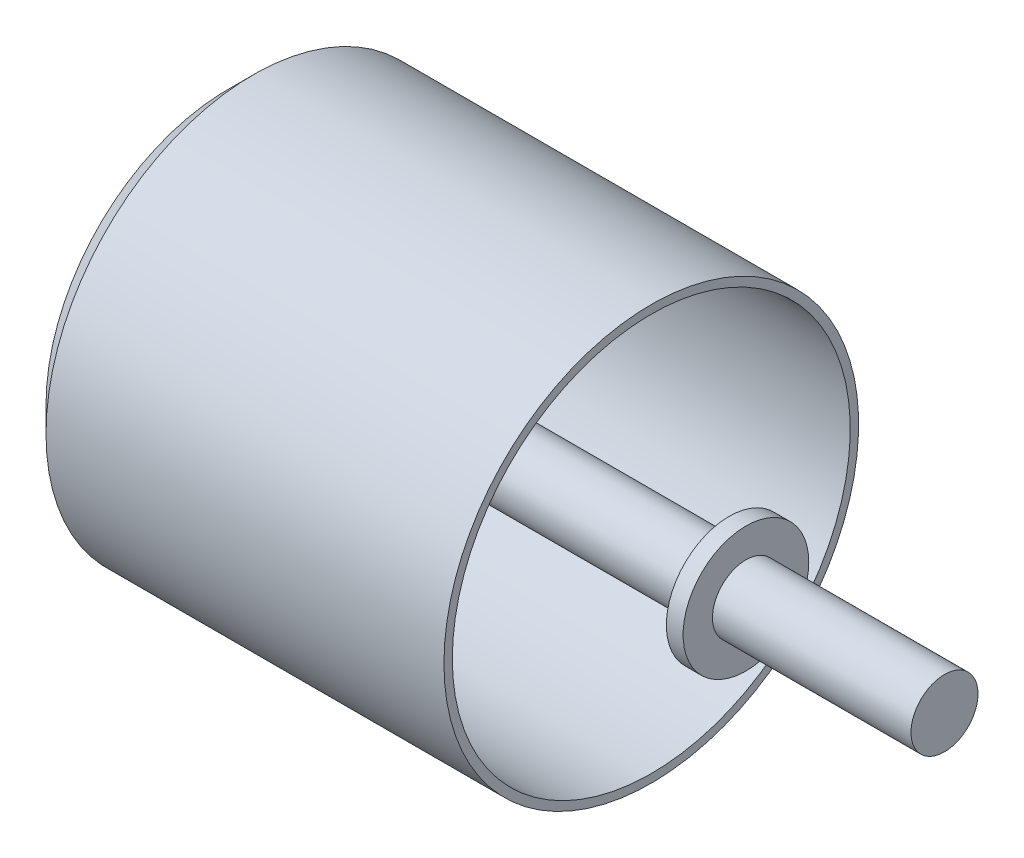
ISO-10303-21;
HEADER;
FILE_DESCRIPTION(('STEP AP214'),'2;1');
FILE_NAME('part.step','',(''),(''),'','','');
FILE_SCHEMA(('AUTOMOTIVE_DESIGN { 1 0 10303 214 1 1 1 1 }'));
ENDSEC;
DATA;
#1=APPLICATION_CONTEXT('core data for automotive mechanical design processes');
#2=APPLICATION_PROTOCOL_DEFINITION('international standard','automotive_design',2000,#1);
#3=PRODUCT_CONTEXT('',#1,'mechanical');
#4=PRODUCT('Part','Part','',(#3));
#5=PRODUCT_RELATED_PRODUCT_CATEGORY('part','',(#4));
#6=PRODUCT_DEFINITION_FORMATION('','',#4);
#7=PRODUCT_DEFINITION_CONTEXT('part definition',#1,'design');
#8=PRODUCT_DEFINITION('design','',#6,#7);
#9=PRODUCT_DEFINITION_SHAPE('','',#8);
#10=(LENGTH_UNIT() NAMED_UNIT(*) SI_UNIT(.MILLI.,.METRE.));
#11=(NAMED_UNIT(*) PLANE_ANGLE_UNIT() SI_UNIT($,.RADIAN.));
#12=(NAMED_UNIT(*) SI_UNIT($,.STERADIAN.) SOLID_ANGLE_UNIT());
#13=UNCERTAINTY_MEASURE_WITH_UNIT(LENGTH_MEASURE(1.E-05),#10,'distance_accuracy_value','');
#14=(GEOMETRIC_REPRESENTATION_CONTEXT(3) GLOBAL_UNCERTAINTY_ASSIGNED_CONTEXT((#13)) GLOBAL_UNIT_ASSIGNED_CONTEXT((#10,
#11,#12)) REPRESENTATION_CONTEXT('',''));
#15=CARTESIAN_POINT('',(0.,0.,0.));
#16=DIRECTION('',(0.,0.,1.));
#17=DIRECTION('',(1.,0.,0.));
#18=AXIS2_PLACEMENT_3D('',#15,#16,#17);
#19=CARTESIAN_POINT('',(85.5,0.,0.));
#20=DIRECTION('',(-1.,0.,0.));
#21=DIRECTION('',(0.,0.,1.));
#22=AXIS2_PLACEMENT_3D('',#19,#20,#21);
#23=CYLINDRICAL_SURFACE('',#22,4.);
#24=CARTESIAN_POINT('',(1.,0.,0.));
#25=DIRECTION('',(-1.,0.,0.));
#26=DIRECTION('',(0.,0.,1.));
#27=AXIS2_PLACEMENT_3D('',#24,#25,#26);
#28=CIRCLE('',#27,4.);
#29=CARTESIAN_POINT('',(1.,0.,4.));
#30=VERTEX_POINT('',#29);
#31=EDGE_CURVE('E43',#30,#30,#28,.F.);
#32=ORIENTED_EDGE('',*,*,#31,.T.);
#33=EDGE_LOOP('',(#32));
#34=FACE_BOUND('',#33,.T.);
#35=CARTESIAN_POINT('',(59.8,0.,0.));
#36=DIRECTION('',(1.,0.,0.));
#37=DIRECTION('',(0.,0.,-1.));
#38=AXIS2_PLACEMENT_3D('',#35,#36,#37);
#39=CIRCLE('',#38,4.);
#40=CARTESIAN_POINT('',(59.8,0.,-4.));
#41=VERTEX_POINT('',#40);
#42=EDGE_CURVE('E10',#41,#41,#39,.T.);
#43=ORIENTED_EDGE('',*,*,#42,.F.);
#44=EDGE_LOOP('',(#43));
#45=FACE_BOUND('',#44,.T.);
#46=ADVANCED_FACE('F35',(#34,#45),#23,.T.);
#47=CARTESIAN_POINT('',(1.,0.,0.));
#48=DIRECTION('',(-1.,0.,0.));
#49=DIRECTION('',(0.,0.,1.));
#50=AXIS2_PLACEMENT_3D('',#47,#48,#49);
#51=PLANE('',#50);
#52=CARTESIAN_POINT('',(1.,17.,0.));
#53=DIRECTION('',(-1.,0.,0.));
#54=DIRECTION('',(0.,0.,1.));
#55=AXIS2_PLACEMENT_3D('',#52,#53,#54);
#56=CIRCLE('',#55,3.5);
#57=CARTESIAN_POINT('',(1.,17.,3.5));
#58=VERTEX_POINT('',#57);
#59=EDGE_CURVE('E70',#58,#58,#56,.T.);
#60=ORIENTED_EDGE('',*,*,#59,.T.);
#61=EDGE_LOOP('',(#60));
#62=FACE_BOUND('',#61,.T.);
#63=CARTESIAN_POINT('',(1.,0.,17.));
#64=DIRECTION('',(-1.,0.,0.));
#65=DIRECTION('',(0.,0.,1.));
#66=AXIS2_PLACEMENT_3D('',#63,#64,#65);
#67=CIRCLE('',#66,3.5);
#68=CARTESIAN_POINT('',(1.,0.,20.5));
#69=VERTEX_POINT('',#68);
#70=EDGE_CURVE('E73',#69,#69,#67,.T.);
#71=ORIENTED_EDGE('',*,*,#70,.T.);
#72=EDGE_LOOP('',(#71));
#73=FACE_BOUND('',#72,.T.);
#74=CARTESIAN_POINT('',(1.,-17.,0.));
#75=DIRECTION('',(-1.,0.,0.));
#76=DIRECTION('',(0.,0.,1.));
#77=AXIS2_PLACEMENT_3D('',#74,#75,#76);
#78=CIRCLE('',#77,3.5);
#79=CARTESIAN_POINT('',(1.,-17.,3.5));
#80=VERTEX_POINT('',#79);
#81=EDGE_CURVE('E76',#80,#80,#78,.T.);
#82=ORIENTED_EDGE('',*,*,#81,.T.);
#83=EDGE_LOOP('',(#82));
#84=FACE_BOUND('',#83,.T.);
#85=CARTESIAN_POINT('',(1.,0.,-17.));
#86=DIRECTION('',(-1.,0.,0.));
#87=DIRECTION('',(0.,0.,1.));
#88=AXIS2_PLACEMENT_3D('',#85,#86,#87);
#89=CIRCLE('',#88,3.5);
#90=CARTESIAN_POINT('',(1.,0.,-13.5));
#91=VERTEX_POINT('',#90);
#92=EDGE_CURVE('E79',#91,#91,#89,.T.);
#93=ORIENTED_EDGE('',*,*,#92,.T.);
#94=EDGE_LOOP('',(#93));
#95=FACE_BOUND('',#94,.T.);
#96=ORIENTED_EDGE('',*,*,#31,.F.);
#97=EDGE_LOOP('',(#96));
#98=FACE_BOUND('',#97,.T.);
#99=CARTESIAN_POINT('',(1.,0.,0.));
#100=DIRECTION('',(-1.,0.,0.));
#101=DIRECTION('',(0.,0.,1.));
#102=AXIS2_PLACEMENT_3D('',#99,#100,#101);
#103=CIRCLE('',#102,21.3357864376269);
#104=CARTESIAN_POINT('',(1.,0.,21.3357864376269));
#105=VERTEX_POINT('',#104);
#106=EDGE_CURVE('E47',#105,#105,#103,.T.);
#107=ORIENTED_EDGE('',*,*,#106,.F.);
#108=EDGE_LOOP('',(#107));
#109=FACE_BOUND('',#108,.T.);
#110=ADVANCED_FACE('F37',(#62,#73,#84,#95,#98,#109),#51,.F.);
#111=CARTESIAN_POINT('',(1.,0.,0.));
#112=DIRECTION('',(1.,0.,0.));
#113=DIRECTION('',(0.,0.,-1.));
#114=AXIS2_PLACEMENT_3D('',#111,#112,#113);
#115=CONICAL_SURFACE('',#114,21.3357864376269,0.785398163397449);
#116=CARTESIAN_POINT('',(3.41421356237309,0.,0.));
#117=DIRECTION('',(-1.,0.,0.));
#118=DIRECTION('',(0.,0.,1.));
#119=AXIS2_PLACEMENT_3D('',#116,#117,#118);
#120=CIRCLE('',#119,23.75);
#121=CARTESIAN_POINT('',(3.41421356237309,0.,23.75));
#122=VERTEX_POINT('',#121);
#123=EDGE_CURVE('E52',#122,#122,#120,.T.);
#124=ORIENTED_EDGE('',*,*,#123,.F.);
#125=EDGE_LOOP('',(#124));
#126=FACE_BOUND('',#125,.T.);
#127=ORIENTED_EDGE('',*,*,#106,.T.);
#128=EDGE_LOOP('',(#127));
#129=FACE_BOUND('',#128,.T.);
#130=ADVANCED_FACE('F127',(#126,#129),#115,.F.);
#131=CARTESIAN_POINT('',(0.,0.,0.));
#132=DIRECTION('',(-1.,0.,0.));
#133=DIRECTION('',(0.,0.,1.));
#134=AXIS2_PLACEMENT_3D('',#131,#132,#133);
#135=CYLINDRICAL_SURFACE('',#134,23.75);
#136=CARTESIAN_POINT('',(50.5,0.,0.));
#137=DIRECTION('',(-1.,0.,0.));
#138=DIRECTION('',(0.,0.,1.));
#139=AXIS2_PLACEMENT_3D('',#136,#137,#138);
#140=CIRCLE('',#139,23.75);
#141=CARTESIAN_POINT('',(50.5,0.,23.75));
#142=VERTEX_POINT('',#141);
#143=EDGE_CURVE('E55',#142,#142,#140,.T.);
#144=ORIENTED_EDGE('',*,*,#143,.F.);
#145=EDGE_LOOP('',(#144));
#146=FACE_BOUND('',#145,.T.);
#147=ORIENTED_EDGE('',*,*,#123,.T.);
#148=EDGE_LOOP('',(#147));
#149=FACE_BOUND('',#148,.T.);
#150=ADVANCED_FACE('F172',(#146,#149),#135,.F.);
#151=CARTESIAN_POINT('',(50.5,23.75,0.));
#152=DIRECTION('',(-1.,0.,0.));
#153=DIRECTION('',(0.,0.,1.));
#154=AXIS2_PLACEMENT_3D('',#151,#152,#153);
#155=PLANE('',#154);
#156=CARTESIAN_POINT('',(50.5,0.,0.));
#157=DIRECTION('',(-1.,0.,0.));
#158=DIRECTION('',(0.,0.,1.));
#159=AXIS2_PLACEMENT_3D('',#156,#157,#158);
#160=CIRCLE('',#159,24.75);
#161=CARTESIAN_POINT('',(50.5,0.,24.75));
#162=VERTEX_POINT('',#161);
#163=EDGE_CURVE('E58',#162,#162,#160,.T.);
#164=ORIENTED_EDGE('',*,*,#163,.F.);
#165=EDGE_LOOP('',(#164));
#166=FACE_BOUND('',#165,.T.);
#167=ORIENTED_EDGE('',*,*,#143,.T.);
#168=EDGE_LOOP('',(#167));
#169=FACE_BOUND('',#168,.T.);
#170=ADVANCED_FACE('F177',(#166,#169),#155,.F.);
#171=CARTESIAN_POINT('',(0.,0.,0.));
#172=DIRECTION('',(-1.,0.,0.));
#173=DIRECTION('',(0.,0.,1.));
#174=AXIS2_PLACEMENT_3D('',#171,#172,#173);
#175=CYLINDRICAL_SURFACE('',#174,24.75);
#176=CARTESIAN_POINT('',(3.,0.,0.));
#177=DIRECTION('',(-1.,0.,0.));
#178=DIRECTION('',(0.,0.,1.));
#179=AXIS2_PLACEMENT_3D('',#176,#177,#178);
#180=CIRCLE('',#179,24.75);
#181=CARTESIAN_POINT('',(3.,0.,24.75));
#182=VERTEX_POINT('',#181);
#183=EDGE_CURVE('E61',#182,#182,#180,.T.);
#184=ORIENTED_EDGE('',*,*,#183,.F.);
#185=EDGE_LOOP('',(#184));
#186=FACE_BOUND('',#185,.T.);
#187=ORIENTED_EDGE('',*,*,#163,.T.);
#188=EDGE_LOOP('',(#187));
#189=FACE_BOUND('',#188,.T.);
#190=ADVANCED_FACE('F184',(#186,#189),#175,.T.);
#191=CARTESIAN_POINT('',(3.,0.,0.));
#192=DIRECTION('',(1.,0.,0.));
#193=DIRECTION('',(0.,0.,-1.));
#194=AXIS2_PLACEMENT_3D('',#191,#192,#193);
#195=CONICAL_SURFACE('',#194,24.75,0.78539816339745);
#196=CARTESIAN_POINT('',(0.,0.,0.));
#197=DIRECTION('',(-1.,0.,0.));
#198=DIRECTION('',(0.,0.,1.));
#199=AXIS2_PLACEMENT_3D('',#196,#197,#198);
#200=CIRCLE('',#199,21.75);
#201=CARTESIAN_POINT('',(0.,0.,21.75));
#202=VERTEX_POINT('',#201);
#203=EDGE_CURVE('E64',#202,#202,#200,.T.);
#204=ORIENTED_EDGE('',*,*,#203,.F.);
#205=EDGE_LOOP('',(#204));
#206=FACE_BOUND('',#205,.T.);
#207=ORIENTED_EDGE('',*,*,#183,.T.);
#208=EDGE_LOOP('',(#207));
#209=FACE_BOUND('',#208,.T.);
#210=ADVANCED_FACE('F188',(#206,#209),#195,.T.);
#211=CARTESIAN_POINT('',(0.,0.,0.));
#212=DIRECTION('',(1.,0.,0.));
#213=DIRECTION('',(0.,0.,-1.));
#214=AXIS2_PLACEMENT_3D('',#211,#212,#213);
#215=PLANE('',#214);
#216=CARTESIAN_POINT('',(0.,17.,0.));
#217=DIRECTION('',(-1.,0.,0.));
#218=DIRECTION('',(0.,0.,1.));
#219=AXIS2_PLACEMENT_3D('',#216,#217,#218);
#220=CIRCLE('',#219,3.5);
#221=CARTESIAN_POINT('',(0.,17.,3.5));
#222=VERTEX_POINT('',#221);
#223=EDGE_CURVE('E82',#222,#222,#220,.T.);
#224=ORIENTED_EDGE('',*,*,#223,.F.);
#225=EDGE_LOOP('',(#224));
#226=FACE_BOUND('',#225,.T.);
#227=CARTESIAN_POINT('',(0.,0.,17.));
#228=DIRECTION('',(-1.,0.,0.));
#229=DIRECTION('',(0.,0.,1.));
#230=AXIS2_PLACEMENT_3D('',#227,#228,#229);
#231=CIRCLE('',#230,3.5);
#232=CARTESIAN_POINT('',(0.,0.,20.5));
#233=VERTEX_POINT('',#232);
#234=EDGE_CURVE('E89',#233,#233,#231,.T.);
#235=ORIENTED_EDGE('',*,*,#234,.F.);
#236=EDGE_LOOP('',(#235));
#237=FACE_BOUND('',#236,.T.);
#238=CARTESIAN_POINT('',(0.,-17.,0.));
#239=DIRECTION('',(-1.,0.,0.));
#240=DIRECTION('',(0.,0.,1.));
#241=AXIS2_PLACEMENT_3D('',#238,#239,#240);
#242=CIRCLE('',#241,3.5);
#243=CARTESIAN_POINT('',(0.,-17.,3.5));
#244=VERTEX_POINT('',#243);
#245=EDGE_CURVE('E86',#244,#244,#242,.T.);
#246=ORIENTED_EDGE('',*,*,#245,.F.);
#247=EDGE_LOOP('',(#246));
#248=FACE_BOUND('',#247,.T.);
#249=CARTESIAN_POINT('',(0.,0.,-17.));
#250=DIRECTION('',(-1.,0.,0.));
#251=DIRECTION('',(0.,0.,1.));
#252=AXIS2_PLACEMENT_3D('',#249,#250,#251);
#253=CIRCLE('',#252,3.5);
#254=CARTESIAN_POINT('',(0.,0.,-13.5));
#255=VERTEX_POINT('',#254);
#256=EDGE_CURVE('E83',#255,#255,#253,.T.);
#257=ORIENTED_EDGE('',*,*,#256,.F.);
#258=EDGE_LOOP('',(#257));
#259=FACE_BOUND('',#258,.T.);
#260=ORIENTED_EDGE('',*,*,#203,.T.);
#261=EDGE_LOOP('',(#260));
#262=FACE_BOUND('',#261,.T.);
#263=ADVANCED_FACE('F144',(#226,#237,#248,#259,#262),#215,.F.);
#264=CARTESIAN_POINT('',(85.5,0.,-17.));
#265=DIRECTION('',(-1.,0.,0.));
#266=DIRECTION('',(0.,0.,1.));
#267=AXIS2_PLACEMENT_3D('',#264,#265,#266);
#268=CYLINDRICAL_SURFACE('',#267,3.5);
#269=ORIENTED_EDGE('',*,*,#256,.T.);
#270=EDGE_LOOP('',(#269));
#271=FACE_BOUND('',#270,.T.);
#272=ORIENTED_EDGE('',*,*,#92,.F.);
#273=EDGE_LOOP('',(#272));
#274=FACE_BOUND('',#273,.T.);
#275=ADVANCED_FACE('F140',(#271,#274),#268,.F.);
#276=CARTESIAN_POINT('',(85.5,-17.,0.));
#277=DIRECTION('',(-1.,0.,0.));
#278=DIRECTION('',(0.,0.,1.));
#279=AXIS2_PLACEMENT_3D('',#276,#277,#278);
#280=CYLINDRICAL_SURFACE('',#279,3.5);
#281=ORIENTED_EDGE('',*,*,#245,.T.);
#282=EDGE_LOOP('',(#281));
#283=FACE_BOUND('',#282,.T.);
#284=ORIENTED_EDGE('',*,*,#81,.F.);
#285=EDGE_LOOP('',(#284));
#286=FACE_BOUND('',#285,.T.);
#287=ADVANCED_FACE('F143',(#283,#286),#280,.F.);
#288=CARTESIAN_POINT('',(85.5,0.,17.));
#289=DIRECTION('',(-1.,0.,0.));
#290=DIRECTION('',(0.,0.,1.));
#291=AXIS2_PLACEMENT_3D('',#288,#289,#290);
#292=CYLINDRICAL_SURFACE('',#291,3.5);
#293=ORIENTED_EDGE('',*,*,#234,.T.);
#294=EDGE_LOOP('',(#293));
#295=FACE_BOUND('',#294,.T.);
#296=ORIENTED_EDGE('',*,*,#70,.F.);
#297=EDGE_LOOP('',(#296));
#298=FACE_BOUND('',#297,.T.);
#299=ADVANCED_FACE('F148',(#295,#298),#292,.F.);
#300=CARTESIAN_POINT('',(85.5,17.,0.));
#301=DIRECTION('',(-1.,0.,0.));
#302=DIRECTION('',(0.,0.,1.));
#303=AXIS2_PLACEMENT_3D('',#300,#301,#302);
#304=CYLINDRICAL_SURFACE('',#303,3.5);
#305=ORIENTED_EDGE('',*,*,#223,.T.);
#306=EDGE_LOOP('',(#305));
#307=FACE_BOUND('',#306,.T.);
#308=ORIENTED_EDGE('',*,*,#59,.F.);
#309=EDGE_LOOP('',(#308));
#310=FACE_BOUND('',#309,.T.);
#311=ADVANCED_FACE('F118',(#307,#310),#304,.F.);
#312=CARTESIAN_POINT('',(61.8,0.,0.));
#313=DIRECTION('',(-1.,0.,0.));
#314=DIRECTION('',(0.,0.,1.));
#315=AXIS2_PLACEMENT_3D('',#312,#313,#314);
#316=CYLINDRICAL_SURFACE('',#315,7.5);
#317=CARTESIAN_POINT('',(61.8,0.,0.));
#318=DIRECTION('',(1.,0.,0.));
#319=DIRECTION('',(0.,0.,-1.));
#320=AXIS2_PLACEMENT_3D('',#317,#318,#319);
#321=CIRCLE('',#320,7.5);
#322=CARTESIAN_POINT('',(61.8,0.,-7.5));
#323=VERTEX_POINT('',#322);
#324=EDGE_CURVE('E97',#323,#323,#321,.T.);
#325=ORIENTED_EDGE('',*,*,#324,.F.);
#326=EDGE_LOOP('',(#325));
#327=FACE_BOUND('',#326,.T.);
#328=CARTESIAN_POINT('',(59.8,0.,0.));
#329=DIRECTION('',(1.,0.,0.));
#330=DIRECTION('',(0.,0.,-1.));
#331=AXIS2_PLACEMENT_3D('',#328,#329,#330);
#332=CIRCLE('',#331,7.5);
#333=CARTESIAN_POINT('',(59.8,0.,-7.5));
#334=VERTEX_POINT('',#333);
#335=EDGE_CURVE('E94',#334,#334,#332,.T.);
#336=ORIENTED_EDGE('',*,*,#335,.T.);
#337=EDGE_LOOP('',(#336));
#338=FACE_BOUND('',#337,.T.);
#339=ADVANCED_FACE('F110',(#327,#338),#316,.T.);
#340=CARTESIAN_POINT('',(61.8,0.,0.));
#341=DIRECTION('',(1.,0.,0.));
#342=DIRECTION('',(0.,0.,-1.));
#343=AXIS2_PLACEMENT_3D('',#340,#341,#342);
#344=PLANE('',#343);
#345=CARTESIAN_POINT('',(61.8,0.,0.));
#346=DIRECTION('',(1.,0.,0.));
#347=DIRECTION('',(0.,0.,-1.));
#348=AXIS2_PLACEMENT_3D('',#345,#346,#347);
#349=CIRCLE('',#348,4.);
#350=CARTESIAN_POINT('',(61.8,0.,-4.));
#351=VERTEX_POINT('',#350);
#352=EDGE_CURVE('E39',#351,#351,#349,.T.);
#353=ORIENTED_EDGE('',*,*,#352,.F.);
#354=EDGE_LOOP('',(#353));
#355=FACE_BOUND('',#354,.T.);
#356=ORIENTED_EDGE('',*,*,#324,.T.);
#357=EDGE_LOOP('',(#356));
#358=FACE_BOUND('',#357,.T.);
#359=ADVANCED_FACE('F107',(#355,#358),#344,.T.);
#360=CARTESIAN_POINT('',(59.8,0.,0.));
#361=DIRECTION('',(1.,0.,0.));
#362=DIRECTION('',(0.,0.,-1.));
#363=AXIS2_PLACEMENT_3D('',#360,#361,#362);
#364=PLANE('',#363);
#365=ORIENTED_EDGE('',*,*,#42,.T.);
#366=EDGE_LOOP('',(#365));
#367=FACE_BOUND('',#366,.T.);
#368=ORIENTED_EDGE('',*,*,#335,.F.);
#369=EDGE_LOOP('',(#368));
#370=FACE_BOUND('',#369,.T.);
#371=ADVANCED_FACE('F109',(#367,#370),#364,.F.);
#372=CARTESIAN_POINT('',(85.5,0.,0.));
#373=DIRECTION('',(1.,0.,0.));
#374=DIRECTION('',(0.,0.,-1.));
#375=AXIS2_PLACEMENT_3D('',#372,#373,#374);
#376=PLANE('',#375);
#377=CARTESIAN_POINT('',(85.5,0.,0.));
#378=DIRECTION('',(1.,0.,0.));
#379=DIRECTION('',(0.,0.,-1.));
#380=AXIS2_PLACEMENT_3D('',#377,#378,#379);
#381=CIRCLE('',#380,4.);
#382=CARTESIAN_POINT('',(85.5,0.,-4.));
#383=VERTEX_POINT('',#382);
#384=EDGE_CURVE('E66',#383,#383,#381,.T.);
#385=ORIENTED_EDGE('',*,*,#384,.T.);
#386=EDGE_LOOP('',(#385));
#387=FACE_BOUND('',#386,.T.);
#388=ADVANCED_FACE('F116',(#387),#376,.T.);
#389=ORIENTED_EDGE('',*,*,#352,.T.);
#390=EDGE_LOOP('',(#389));
#391=FACE_BOUND('',#390,.T.);
#392=ORIENTED_EDGE('',*,*,#384,.F.);
#393=EDGE_LOOP('',(#392));
#394=FACE_BOUND('',#393,.T.);
#395=ADVANCED_FACE('F104',(#391,#394),#23,.T.);
#396=CLOSED_SHELL('',(#46,#110,#130,#150,#170,#190,#210,#263,#275,#287,#299,#311,#339,#359,#371,
#388,#395));
#397=MANIFOLD_SOLID_BREP('B2',#396);
#398=ADVANCED_BREP_SHAPE_REPRESENTATION('',(#18,#397),#14);
#399=SHAPE_DEFINITION_REPRESENTATION(#9,#398);
ENDSEC;
END-ISO-10303-21;
